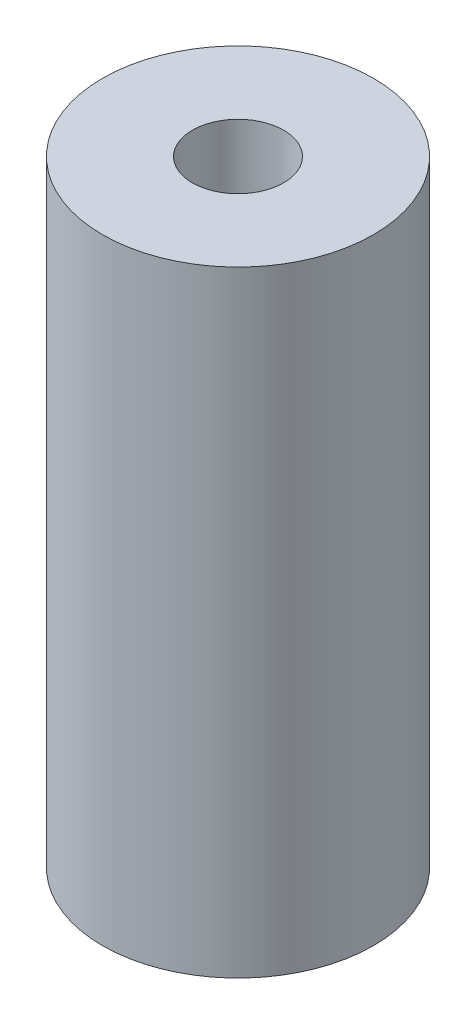
ISO-10303-21;
HEADER;
FILE_DESCRIPTION(('STEP AP214'),'2;1');
FILE_NAME('part.step','',(''),(''),'','','');
FILE_SCHEMA(('AUTOMOTIVE_DESIGN { 1 0 10303 214 1 1 1 1 }'));
ENDSEC;
DATA;
#1=APPLICATION_CONTEXT('core data for automotive mechanical design processes');
#2=APPLICATION_PROTOCOL_DEFINITION('international standard','automotive_design',2000,#1);
#3=PRODUCT_CONTEXT('',#1,'mechanical');
#4=PRODUCT('Part','Part','',(#3));
#5=PRODUCT_RELATED_PRODUCT_CATEGORY('part','',(#4));
#6=PRODUCT_DEFINITION_FORMATION('','',#4);
#7=PRODUCT_DEFINITION_CONTEXT('part definition',#1,'design');
#8=PRODUCT_DEFINITION('design','',#6,#7);
#9=PRODUCT_DEFINITION_SHAPE('','',#8);
#10=(LENGTH_UNIT() NAMED_UNIT(*) SI_UNIT(.MILLI.,.METRE.));
#11=(NAMED_UNIT(*) PLANE_ANGLE_UNIT() SI_UNIT($,.RADIAN.));
#12=(NAMED_UNIT(*) SI_UNIT($,.STERADIAN.) SOLID_ANGLE_UNIT());
#13=UNCERTAINTY_MEASURE_WITH_UNIT(LENGTH_MEASURE(1.E-05),#10,'distance_accuracy_value','');
#14=(GEOMETRIC_REPRESENTATION_CONTEXT(3) GLOBAL_UNCERTAINTY_ASSIGNED_CONTEXT((#13)) GLOBAL_UNIT_ASSIGNED_CONTEXT((#10,
#11,#12)) REPRESENTATION_CONTEXT('',''));
#15=CARTESIAN_POINT('',(0.,0.,0.));
#16=DIRECTION('',(0.,0.,1.));
#17=DIRECTION('',(1.,0.,0.));
#18=AXIS2_PLACEMENT_3D('',#15,#16,#17);
#19=CARTESIAN_POINT('',(0.,107.95,0.));
#20=DIRECTION('',(0.,1.,0.));
#21=DIRECTION('',(0.,0.,1.));
#22=AXIS2_PLACEMENT_3D('',#19,#20,#21);
#23=PLANE('',#22);
#24=CARTESIAN_POINT('',(0.,107.95,0.));
#25=DIRECTION('',(0.,1.,0.));
#26=DIRECTION('',(0.,0.,1.));
#27=AXIS2_PLACEMENT_3D('',#24,#25,#26);
#28=CIRCLE('',#27,23.749);
#29=CARTESIAN_POINT('',(0.,107.95,23.749));
#30=VERTEX_POINT('',#29);
#31=EDGE_CURVE('E10',#30,#30,#28,.T.);
#32=ORIENTED_EDGE('',*,*,#31,.T.);
#33=EDGE_LOOP('',(#32));
#34=FACE_BOUND('',#33,.T.);
#35=CARTESIAN_POINT('',(0.,107.95,0.));
#36=DIRECTION('',(0.,1.,0.));
#37=DIRECTION('',(0.,0.,1.));
#38=AXIS2_PLACEMENT_3D('',#35,#36,#37);
#39=CIRCLE('',#38,8.001);
#40=CARTESIAN_POINT('',(0.,107.95,8.001));
#41=VERTEX_POINT('',#40);
#42=EDGE_CURVE('E48',#41,#41,#39,.T.);
#43=ORIENTED_EDGE('',*,*,#42,.F.);
#44=EDGE_LOOP('',(#43));
#45=FACE_BOUND('',#44,.T.);
#46=ADVANCED_FACE('F37',(#34,#45),#23,.T.);
#47=CARTESIAN_POINT('',(0.,0.,0.));
#48=DIRECTION('',(0.,1.,0.));
#49=DIRECTION('',(0.,0.,1.));
#50=AXIS2_PLACEMENT_3D('',#47,#48,#49);
#51=PLANE('',#50);
#52=CARTESIAN_POINT('',(0.,0.,0.));
#53=DIRECTION('',(0.,1.,0.));
#54=DIRECTION('',(0.,0.,1.));
#55=AXIS2_PLACEMENT_3D('',#52,#53,#54);
#56=CIRCLE('',#55,23.749);
#57=CARTESIAN_POINT('',(0.,0.,23.749));
#58=VERTEX_POINT('',#57);
#59=EDGE_CURVE('E41',#58,#58,#56,.T.);
#60=ORIENTED_EDGE('',*,*,#59,.F.);
#61=EDGE_LOOP('',(#60));
#62=FACE_BOUND('',#61,.T.);
#63=CARTESIAN_POINT('',(0.,0.,0.));
#64=DIRECTION('',(0.,1.,0.));
#65=DIRECTION('',(0.,0.,1.));
#66=AXIS2_PLACEMENT_3D('',#63,#64,#65);
#67=CIRCLE('',#66,8.001);
#68=CARTESIAN_POINT('',(0.,0.,8.001));
#69=VERTEX_POINT('',#68);
#70=EDGE_CURVE('E50',#69,#69,#67,.T.);
#71=ORIENTED_EDGE('',*,*,#70,.T.);
#72=EDGE_LOOP('',(#71));
#73=FACE_BOUND('',#72,.T.);
#74=ADVANCED_FACE('F60',(#62,#73),#51,.F.);
#75=CARTESIAN_POINT('',(0.,107.95,0.));
#76=DIRECTION('',(0.,-1.,0.));
#77=DIRECTION('',(0.,0.,-1.));
#78=AXIS2_PLACEMENT_3D('',#75,#76,#77);
#79=CYLINDRICAL_SURFACE('',#78,23.749);
#80=ORIENTED_EDGE('',*,*,#31,.F.);
#81=EDGE_LOOP('',(#80));
#82=FACE_BOUND('',#81,.T.);
#83=ORIENTED_EDGE('',*,*,#59,.T.);
#84=EDGE_LOOP('',(#83));
#85=FACE_BOUND('',#84,.T.);
#86=ADVANCED_FACE('F39',(#82,#85),#79,.T.);
#87=CARTESIAN_POINT('',(0.,107.95,0.));
#88=DIRECTION('',(0.,-1.,0.));
#89=DIRECTION('',(0.,0.,-1.));
#90=AXIS2_PLACEMENT_3D('',#87,#88,#89);
#91=CYLINDRICAL_SURFACE('',#90,8.001);
#92=ORIENTED_EDGE('',*,*,#42,.T.);
#93=EDGE_LOOP('',(#92));
#94=FACE_BOUND('',#93,.T.);
#95=ORIENTED_EDGE('',*,*,#70,.F.);
#96=EDGE_LOOP('',(#95));
#97=FACE_BOUND('',#96,.T.);
#98=ADVANCED_FACE('F56',(#94,#97),#91,.F.);
#99=CLOSED_SHELL('',(#46,#74,#86,#98));
#100=MANIFOLD_SOLID_BREP('B2',#99);
#101=ADVANCED_BREP_SHAPE_REPRESENTATION('',(#18,#100),#14);
#102=SHAPE_DEFINITION_REPRESENTATION(#9,#101);
ENDSEC;
END-ISO-10303-21;
